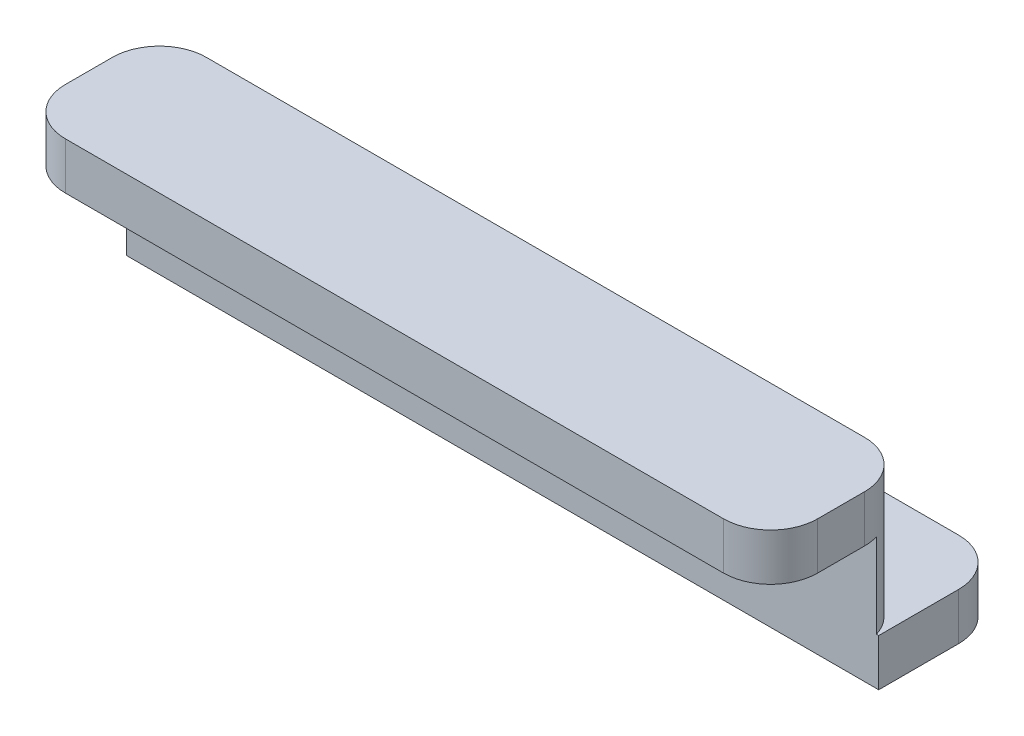
ISO-10303-21;
HEADER;
FILE_DESCRIPTION(('STEP AP214'),'2;1');
FILE_NAME('part.step','',(''),(''),'','','');
FILE_SCHEMA(('AUTOMOTIVE_DESIGN { 1 0 10303 214 1 1 1 1 }'));
ENDSEC;
DATA;
#1=APPLICATION_CONTEXT('core data for automotive mechanical design processes');
#2=APPLICATION_PROTOCOL_DEFINITION('international standard','automotive_design',2000,#1);
#3=PRODUCT_CONTEXT('',#1,'mechanical');
#4=PRODUCT('Part','Part','',(#3));
#5=PRODUCT_RELATED_PRODUCT_CATEGORY('part','',(#4));
#6=PRODUCT_DEFINITION_FORMATION('','',#4);
#7=PRODUCT_DEFINITION_CONTEXT('part definition',#1,'design');
#8=PRODUCT_DEFINITION('design','',#6,#7);
#9=PRODUCT_DEFINITION_SHAPE('','',#8);
#10=(LENGTH_UNIT() NAMED_UNIT(*) SI_UNIT(.MILLI.,.METRE.));
#11=(NAMED_UNIT(*) PLANE_ANGLE_UNIT() SI_UNIT($,.RADIAN.));
#12=(NAMED_UNIT(*) SI_UNIT($,.STERADIAN.) SOLID_ANGLE_UNIT());
#13=UNCERTAINTY_MEASURE_WITH_UNIT(LENGTH_MEASURE(1.E-05),#10,'distance_accuracy_value','');
#14=(GEOMETRIC_REPRESENTATION_CONTEXT(3) GLOBAL_UNCERTAINTY_ASSIGNED_CONTEXT((#13)) GLOBAL_UNIT_ASSIGNED_CONTEXT((#10,
#11,#12)) REPRESENTATION_CONTEXT('',''));
#15=CARTESIAN_POINT('',(0.,0.,0.));
#16=DIRECTION('',(0.,0.,1.));
#17=DIRECTION('',(1.,0.,0.));
#18=AXIS2_PLACEMENT_3D('',#15,#16,#17);
#19=CARTESIAN_POINT('',(30.,2.,-4.));
#20=DIRECTION('',(0.,-1.,0.));
#21=DIRECTION('',(0.,0.,-1.));
#22=AXIS2_PLACEMENT_3D('',#19,#20,#21);
#23=CYLINDRICAL_SURFACE('',#22,2.);
#24=DIRECTION('',(0.,-1.,0.));
#25=VECTOR('',#24,1.);
#26=CARTESIAN_POINT('',(31.9078784028339,2.,-4.6));
#27=LINE('',#26,#25);
#28=CARTESIAN_POINT('',(31.9078784028339,-3.59999999999977,-4.6));
#29=VERTEX_POINT('',#28);
#30=CARTESIAN_POINT('',(31.9078784028339,0.,-4.6));
#31=VERTEX_POINT('',#30);
#32=EDGE_CURVE('E221',#29,#31,#27,.F.);
#33=ORIENTED_EDGE('',*,*,#32,.F.);
#34=CARTESIAN_POINT('',(30.,-3.59999999999978,-4.00000000000001));
#35=DIRECTION('',(0.,1.,0.));
#36=DIRECTION('',(1.,0.,0.));
#37=AXIS2_PLACEMENT_3D('',#34,#35,#36);
#38=CIRCLE('',#37,2.00000000000001);
#39=CARTESIAN_POINT('',(30.,-3.59999999999987,-6.));
#40=VERTEX_POINT('',#39);
#41=EDGE_CURVE('E244',#29,#40,#38,.T.);
#42=ORIENTED_EDGE('',*,*,#41,.T.);
#43=DIRECTION('',(0.,-1.,0.));
#44=VECTOR('',#43,1.);
#45=CARTESIAN_POINT('',(30.,2.,-6.));
#46=LINE('',#45,#44);
#47=CARTESIAN_POINT('',(30.,2.,-6.));
#48=VERTEX_POINT('',#47);
#49=EDGE_CURVE('E215',#48,#40,#46,.T.);
#50=ORIENTED_EDGE('',*,*,#49,.F.);
#51=CARTESIAN_POINT('',(30.,2.,-4.));
#52=DIRECTION('',(0.,1.,0.));
#53=DIRECTION('',(0.,0.,-1.));
#54=AXIS2_PLACEMENT_3D('',#51,#52,#53);
#55=CIRCLE('',#54,2.);
#56=CARTESIAN_POINT('',(32.,2.,-4.));
#57=VERTEX_POINT('',#56);
#58=EDGE_CURVE('E172',#57,#48,#55,.T.);
#59=ORIENTED_EDGE('',*,*,#58,.F.);
#60=DIRECTION('',(0.,-1.,0.));
#61=VECTOR('',#60,1.);
#62=CARTESIAN_POINT('',(32.,2.,-4.));
#63=LINE('',#62,#61);
#64=CARTESIAN_POINT('',(32.,0.,-4.));
#65=VERTEX_POINT('',#64);
#66=EDGE_CURVE('E190',#57,#65,#63,.T.);
#67=ORIENTED_EDGE('',*,*,#66,.T.);
#68=CARTESIAN_POINT('',(30.,0.,-4.));
#69=DIRECTION('',(0.,-1.,0.));
#70=DIRECTION('',(0.,0.,-1.));
#71=AXIS2_PLACEMENT_3D('',#68,#69,#70);
#72=CIRCLE('',#71,2.);
#73=EDGE_CURVE('E232',#31,#65,#72,.T.);
#74=ORIENTED_EDGE('',*,*,#73,.F.);
#75=EDGE_LOOP('',(#33,#42,#50,#59,#67,#74));
#76=FACE_BOUND('',#75,.T.);
#77=ADVANCED_FACE('F33',(#76),#23,.T.);
#78=CARTESIAN_POINT('',(2.,2.,-4.));
#79=DIRECTION('',(0.,-1.,0.));
#80=DIRECTION('',(0.,0.,-1.));
#81=AXIS2_PLACEMENT_3D('',#78,#79,#80);
#82=CYLINDRICAL_SURFACE('',#81,2.);
#83=DIRECTION('',(0.,-1.,0.));
#84=VECTOR('',#83,1.);
#85=CARTESIAN_POINT('',(0.0921215971661099,2.,-4.6));
#86=LINE('',#85,#84);
#87=CARTESIAN_POINT('',(0.0921215971661099,0.,-4.6));
#88=VERTEX_POINT('',#87);
#89=CARTESIAN_POINT('',(0.0921215971661467,-3.59999999999999,-4.6));
#90=VERTEX_POINT('',#89);
#91=EDGE_CURVE('E47',#88,#90,#86,.T.);
#92=ORIENTED_EDGE('',*,*,#91,.F.);
#93=CARTESIAN_POINT('',(2.,0.,-4.));
#94=DIRECTION('',(0.,-1.,0.));
#95=DIRECTION('',(0.,0.,-1.));
#96=AXIS2_PLACEMENT_3D('',#93,#94,#95);
#97=CIRCLE('',#96,2.);
#98=CARTESIAN_POINT('',(0.,0.,-4.));
#99=VERTEX_POINT('',#98);
#100=EDGE_CURVE('E225',#99,#88,#97,.T.);
#101=ORIENTED_EDGE('',*,*,#100,.F.);
#102=DIRECTION('',(0.,-1.,0.));
#103=VECTOR('',#102,1.);
#104=CARTESIAN_POINT('',(0.,2.,-4.));
#105=LINE('',#104,#103);
#106=CARTESIAN_POINT('',(0.,2.,-4.));
#107=VERTEX_POINT('',#106);
#108=EDGE_CURVE('E209',#107,#99,#105,.T.);
#109=ORIENTED_EDGE('',*,*,#108,.F.);
#110=CARTESIAN_POINT('',(2.,2.,-4.));
#111=DIRECTION('',(0.,1.,0.));
#112=DIRECTION('',(0.,0.,-1.));
#113=AXIS2_PLACEMENT_3D('',#110,#111,#112);
#114=CIRCLE('',#113,2.);
#115=CARTESIAN_POINT('',(2.,2.,-6.));
#116=VERTEX_POINT('',#115);
#117=EDGE_CURVE('E178',#116,#107,#114,.T.);
#118=ORIENTED_EDGE('',*,*,#117,.F.);
#119=DIRECTION('',(0.,-1.,0.));
#120=VECTOR('',#119,1.);
#121=CARTESIAN_POINT('',(2.,2.,-6.));
#122=LINE('',#121,#120);
#123=CARTESIAN_POINT('',(2.,-3.59999999999996,-6.));
#124=VERTEX_POINT('',#123);
#125=EDGE_CURVE('E212',#116,#124,#122,.T.);
#126=ORIENTED_EDGE('',*,*,#125,.T.);
#127=CARTESIAN_POINT('',(2.00000000000004,-3.59999999999998,-4.00000000000001));
#128=DIRECTION('',(0.,1.,0.));
#129=DIRECTION('',(1.,0.,0.));
#130=AXIS2_PLACEMENT_3D('',#127,#128,#129);
#131=CIRCLE('',#130,2.);
#132=EDGE_CURVE('E237',#124,#90,#131,.T.);
#133=ORIENTED_EDGE('',*,*,#132,.T.);
#134=EDGE_LOOP('',(#92,#101,#109,#118,#126,#133));
#135=FACE_BOUND('',#134,.T.);
#136=ADVANCED_FACE('F235',(#135),#82,.T.);
#137=CARTESIAN_POINT('',(0.,2.,-2.));
#138=DIRECTION('',(1.,0.,0.));
#139=DIRECTION('',(0.,0.,-1.));
#140=AXIS2_PLACEMENT_3D('',#137,#138,#139);
#141=PLANE('',#140);
#142=DIRECTION('',(0.,1.,0.));
#143=VECTOR('',#142,1.);
#144=CARTESIAN_POINT('',(0.,-5.6,-4.6));
#145=LINE('',#144,#143);
#146=CARTESIAN_POINT('',(0.,-5.6,-4.6));
#147=VERTEX_POINT('',#146);
#148=CARTESIAN_POINT('',(0.,-3.59999999999988,-4.6));
#149=VERTEX_POINT('',#148);
#150=EDGE_CURVE('E153',#147,#149,#145,.T.);
#151=ORIENTED_EDGE('',*,*,#150,.T.);
#152=DIRECTION('',(0.,0.,-1.));
#153=VECTOR('',#152,1.);
#154=CARTESIAN_POINT('',(0.,-3.59999999999999,-4.00000000000001));
#155=LINE('',#154,#153);
#156=CARTESIAN_POINT('',(0.,-3.59999999999998,-8.));
#157=VERTEX_POINT('',#156);
#158=EDGE_CURVE('E250',#149,#157,#155,.T.);
#159=ORIENTED_EDGE('',*,*,#158,.T.);
#160=DIRECTION('',(0.,-1.,0.));
#161=VECTOR('',#160,1.);
#162=CARTESIAN_POINT('',(0.,-3.59999999999998,-8.));
#163=LINE('',#162,#161);
#164=CARTESIAN_POINT('',(0.,-5.59999999999998,-8.00000000000001));
#165=VERTEX_POINT('',#164);
#166=EDGE_CURVE('E160',#157,#165,#163,.T.);
#167=ORIENTED_EDGE('',*,*,#166,.T.);
#168=DIRECTION('',(0.,0.,1.));
#169=VECTOR('',#168,1.);
#170=CARTESIAN_POINT('',(0.,-5.6,-4.));
#171=LINE('',#170,#169);
#172=EDGE_CURVE('E147',#165,#147,#171,.T.);
#173=ORIENTED_EDGE('',*,*,#172,.T.);
#174=EDGE_LOOP('',(#151,#159,#167,#173));
#175=FACE_BOUND('',#174,.T.);
#176=ADVANCED_FACE('F158',(#175),#141,.F.);
#177=DIRECTION('',(0.,0.,-1.));
#178=VECTOR('',#177,1.);
#179=CARTESIAN_POINT('',(0.,0.,0.));
#180=LINE('',#179,#178);
#181=CARTESIAN_POINT('',(0.,0.,-2.));
#182=VERTEX_POINT('',#181);
#183=EDGE_CURVE('E229',#182,#99,#180,.T.);
#184=ORIENTED_EDGE('',*,*,#183,.F.);
#185=DIRECTION('',(0.,-1.,0.));
#186=VECTOR('',#185,1.);
#187=CARTESIAN_POINT('',(0.,2.,-2.));
#188=LINE('',#187,#186);
#189=CARTESIAN_POINT('',(0.,2.,-2.));
#190=VERTEX_POINT('',#189);
#191=EDGE_CURVE('E206',#190,#182,#188,.T.);
#192=ORIENTED_EDGE('',*,*,#191,.F.);
#193=DIRECTION('',(0.,0.,1.));
#194=VECTOR('',#193,1.);
#195=CARTESIAN_POINT('',(0.,2.,-2.));
#196=LINE('',#195,#194);
#197=EDGE_CURVE('E180',#107,#190,#196,.T.);
#198=ORIENTED_EDGE('',*,*,#197,.F.);
#199=ORIENTED_EDGE('',*,*,#108,.T.);
#200=EDGE_LOOP('',(#184,#192,#198,#199));
#201=FACE_BOUND('',#200,.T.);
#202=ADVANCED_FACE('F306',(#201),#141,.F.);
#203=CARTESIAN_POINT('',(2.,2.,-2.));
#204=DIRECTION('',(0.,-1.,0.));
#205=DIRECTION('',(0.,0.,-1.));
#206=AXIS2_PLACEMENT_3D('',#203,#204,#205);
#207=CYLINDRICAL_SURFACE('',#206,2.);
#208=ORIENTED_EDGE('',*,*,#191,.T.);
#209=CARTESIAN_POINT('',(2.,0.,-2.));
#210=DIRECTION('',(0.,1.,0.));
#211=DIRECTION('',(0.,0.,-1.));
#212=AXIS2_PLACEMENT_3D('',#209,#210,#211);
#213=CIRCLE('',#212,2.);
#214=CARTESIAN_POINT('',(2.,0.,0.));
#215=VERTEX_POINT('',#214);
#216=EDGE_CURVE('E171',#182,#215,#213,.T.);
#217=ORIENTED_EDGE('',*,*,#216,.T.);
#218=DIRECTION('',(0.,-1.,0.));
#219=VECTOR('',#218,1.);
#220=CARTESIAN_POINT('',(2.,2.,0.));
#221=LINE('',#220,#219);
#222=CARTESIAN_POINT('',(2.,2.,0.));
#223=VERTEX_POINT('',#222);
#224=EDGE_CURVE('E203',#223,#215,#221,.T.);
#225=ORIENTED_EDGE('',*,*,#224,.F.);
#226=CARTESIAN_POINT('',(2.,2.,-2.));
#227=DIRECTION('',(0.,1.,0.));
#228=DIRECTION('',(0.,0.,-1.));
#229=AXIS2_PLACEMENT_3D('',#226,#227,#228);
#230=CIRCLE('',#229,2.);
#231=EDGE_CURVE('E182',#190,#223,#230,.T.);
#232=ORIENTED_EDGE('',*,*,#231,.F.);
#233=EDGE_LOOP('',(#208,#217,#225,#232));
#234=FACE_BOUND('',#233,.T.);
#235=ADVANCED_FACE('F309',(#234),#207,.T.);
#236=CARTESIAN_POINT('',(30.,2.,-2.));
#237=DIRECTION('',(0.,-1.,0.));
#238=DIRECTION('',(0.,0.,-1.));
#239=AXIS2_PLACEMENT_3D('',#236,#237,#238);
#240=CYLINDRICAL_SURFACE('',#239,2.);
#241=CARTESIAN_POINT('',(30.,0.,-2.));
#242=DIRECTION('',(0.,1.,0.));
#243=DIRECTION('',(0.,0.,1.));
#244=AXIS2_PLACEMENT_3D('',#241,#242,#243);
#245=CIRCLE('',#244,2.);
#246=CARTESIAN_POINT('',(30.,0.,0.));
#247=VERTEX_POINT('',#246);
#248=CARTESIAN_POINT('',(32.,0.,-2.));
#249=VERTEX_POINT('',#248);
#250=EDGE_CURVE('E176',#247,#249,#245,.T.);
#251=ORIENTED_EDGE('',*,*,#250,.T.);
#252=DIRECTION('',(0.,-1.,0.));
#253=VECTOR('',#252,1.);
#254=CARTESIAN_POINT('',(32.,2.,-2.));
#255=LINE('',#254,#253);
#256=CARTESIAN_POINT('',(32.,2.,-2.));
#257=VERTEX_POINT('',#256);
#258=EDGE_CURVE('E197',#257,#249,#255,.T.);
#259=ORIENTED_EDGE('',*,*,#258,.F.);
#260=CARTESIAN_POINT('',(30.,2.,-2.));
#261=DIRECTION('',(0.,1.,0.));
#262=DIRECTION('',(0.,0.,1.));
#263=AXIS2_PLACEMENT_3D('',#260,#261,#262);
#264=CIRCLE('',#263,2.);
#265=CARTESIAN_POINT('',(30.,2.,0.));
#266=VERTEX_POINT('',#265);
#267=EDGE_CURVE('E186',#266,#257,#264,.T.);
#268=ORIENTED_EDGE('',*,*,#267,.F.);
#269=DIRECTION('',(0.,-1.,0.));
#270=VECTOR('',#269,1.);
#271=CARTESIAN_POINT('',(30.,2.,0.));
#272=LINE('',#271,#270);
#273=EDGE_CURVE('E200',#266,#247,#272,.T.);
#274=ORIENTED_EDGE('',*,*,#273,.T.);
#275=EDGE_LOOP('',(#251,#259,#268,#274));
#276=FACE_BOUND('',#275,.T.);
#277=ADVANCED_FACE('F297',(#276),#240,.T.);
#278=CARTESIAN_POINT('',(32.,2.,-2.));
#279=DIRECTION('',(-1.,0.,0.));
#280=DIRECTION('',(0.,0.,1.));
#281=AXIS2_PLACEMENT_3D('',#278,#279,#280);
#282=PLANE('',#281);
#283=DIRECTION('',(0.,1.,0.));
#284=VECTOR('',#283,1.);
#285=CARTESIAN_POINT('',(32.,-5.6,-4.6));
#286=LINE('',#285,#284);
#287=CARTESIAN_POINT('',(32.,-5.6,-4.6));
#288=VERTEX_POINT('',#287);
#289=CARTESIAN_POINT('',(32.,-3.59999999999977,-4.6));
#290=VERTEX_POINT('',#289);
#291=EDGE_CURVE('E53',#288,#290,#286,.T.);
#292=ORIENTED_EDGE('',*,*,#291,.F.);
#293=DIRECTION('',(0.,0.,-1.));
#294=VECTOR('',#293,1.);
#295=CARTESIAN_POINT('',(32.,-5.6,-4.));
#296=LINE('',#295,#294);
#297=CARTESIAN_POINT('',(32.,-5.59999999999976,-8.00000000000001));
#298=VERTEX_POINT('',#297);
#299=EDGE_CURVE('E150',#288,#298,#296,.T.);
#300=ORIENTED_EDGE('',*,*,#299,.T.);
#301=DIRECTION('',(0.,-1.,0.));
#302=VECTOR('',#301,1.);
#303=CARTESIAN_POINT('',(32.,-3.59999999999976,-8.));
#304=LINE('',#303,#302);
#305=CARTESIAN_POINT('',(32.,-3.59999999999976,-8.));
#306=VERTEX_POINT('',#305);
#307=EDGE_CURVE('E162',#306,#298,#304,.T.);
#308=ORIENTED_EDGE('',*,*,#307,.F.);
#309=DIRECTION('',(0.,0.,1.));
#310=VECTOR('',#309,1.);
#311=CARTESIAN_POINT('',(32.,-3.59999999999976,-8.));
#312=LINE('',#311,#310);
#313=EDGE_CURVE('E261',#306,#290,#312,.T.);
#314=ORIENTED_EDGE('',*,*,#313,.T.);
#315=EDGE_LOOP('',(#292,#300,#308,#314));
#316=FACE_BOUND('',#315,.T.);
#317=ADVANCED_FACE('F283',(#316),#282,.F.);
#318=DIRECTION('',(0.,0.,1.));
#319=VECTOR('',#318,1.);
#320=CARTESIAN_POINT('',(32.,0.,0.));
#321=LINE('',#320,#319);
#322=EDGE_CURVE('E284',#65,#249,#321,.T.);
#323=ORIENTED_EDGE('',*,*,#322,.F.);
#324=ORIENTED_EDGE('',*,*,#66,.F.);
#325=DIRECTION('',(0.,0.,-1.));
#326=VECTOR('',#325,1.);
#327=CARTESIAN_POINT('',(32.,2.,-2.));
#328=LINE('',#327,#326);
#329=EDGE_CURVE('E188',#257,#57,#328,.T.);
#330=ORIENTED_EDGE('',*,*,#329,.F.);
#331=ORIENTED_EDGE('',*,*,#258,.T.);
#332=EDGE_LOOP('',(#323,#324,#330,#331));
#333=FACE_BOUND('',#332,.T.);
#334=ADVANCED_FACE('F294',(#333),#282,.F.);
#335=CARTESIAN_POINT('',(2.,-5.6,-4.));
#336=DIRECTION('',(0.,1.,0.));
#337=DIRECTION('',(0.,0.,1.));
#338=AXIS2_PLACEMENT_3D('',#335,#336,#337);
#339=PLANE('',#338);
#340=DIRECTION('',(1.,0.,0.));
#341=VECTOR('',#340,1.);
#342=CARTESIAN_POINT('',(3.4,-5.6,-4.6));
#343=LINE('',#342,#341);
#344=EDGE_CURVE('E142',#147,#288,#343,.T.);
#345=ORIENTED_EDGE('',*,*,#344,.F.);
#346=ORIENTED_EDGE('',*,*,#172,.F.);
#347=CARTESIAN_POINT('',(2.,-5.59999999999997,-8.00000000000001));
#348=DIRECTION('',(0.,-1.,0.));
#349=DIRECTION('',(1.,0.,0.));
#350=AXIS2_PLACEMENT_3D('',#347,#348,#349);
#351=CIRCLE('',#350,2.);
#352=CARTESIAN_POINT('',(2.,-5.59999999999996,-10.));
#353=VERTEX_POINT('',#352);
#354=EDGE_CURVE('E243',#165,#353,#351,.T.);
#355=ORIENTED_EDGE('',*,*,#354,.T.);
#356=DIRECTION('',(1.,0.,0.));
#357=VECTOR('',#356,1.);
#358=CARTESIAN_POINT('',(2.,-5.59999999999996,-10.));
#359=LINE('',#358,#357);
#360=CARTESIAN_POINT('',(30.,-5.59999999999977,-10.));
#361=VERTEX_POINT('',#360);
#362=EDGE_CURVE('E265',#353,#361,#359,.T.);
#363=ORIENTED_EDGE('',*,*,#362,.T.);
#364=CARTESIAN_POINT('',(30.,-5.59999999999977,-8.00000000000001));
#365=DIRECTION('',(0.,-1.,0.));
#366=DIRECTION('',(1.,0.,0.));
#367=AXIS2_PLACEMENT_3D('',#364,#365,#366);
#368=CIRCLE('',#367,2.);
#369=EDGE_CURVE('E247',#361,#298,#368,.T.);
#370=ORIENTED_EDGE('',*,*,#369,.T.);
#371=ORIENTED_EDGE('',*,*,#299,.F.);
#372=EDGE_LOOP('',(#345,#346,#355,#363,#370,#371));
#373=FACE_BOUND('',#372,.T.);
#374=ADVANCED_FACE('F144',(#373),#339,.F.);
#375=CARTESIAN_POINT('',(30.,-3.59999999999978,-4.00000000000001));
#376=DIRECTION('',(0.,-1.,0.));
#377=DIRECTION('',(1.,0.,0.));
#378=AXIS2_PLACEMENT_3D('',#375,#376,#377);
#379=PLANE('',#378);
#380=DIRECTION('',(-1.,0.,0.));
#381=VECTOR('',#380,1.);
#382=CARTESIAN_POINT('',(30.,-3.59999999999978,-4.6));
#383=LINE('',#382,#381);
#384=EDGE_CURVE('E11',#290,#29,#383,.T.);
#385=ORIENTED_EDGE('',*,*,#384,.F.);
#386=ORIENTED_EDGE('',*,*,#313,.F.);
#387=CARTESIAN_POINT('',(30.,-3.59999999999977,-8.));
#388=DIRECTION('',(0.,-1.,0.));
#389=DIRECTION('',(1.,0.,0.));
#390=AXIS2_PLACEMENT_3D('',#387,#388,#389);
#391=CIRCLE('',#390,2.);
#392=CARTESIAN_POINT('',(30.,-3.59999999999977,-10.));
#393=VERTEX_POINT('',#392);
#394=EDGE_CURVE('E258',#393,#306,#391,.T.);
#395=ORIENTED_EDGE('',*,*,#394,.F.);
#396=DIRECTION('',(1.,0.,0.));
#397=VECTOR('',#396,1.);
#398=CARTESIAN_POINT('',(1.99999999999999,-3.59999999999996,-10.));
#399=LINE('',#398,#397);
#400=CARTESIAN_POINT('',(1.99999999999999,-3.59999999999996,-10.));
#401=VERTEX_POINT('',#400);
#402=EDGE_CURVE('E255',#401,#393,#399,.T.);
#403=ORIENTED_EDGE('',*,*,#402,.F.);
#404=CARTESIAN_POINT('',(1.99999999999999,-3.59999999999997,-8.));
#405=DIRECTION('',(0.,-1.,0.));
#406=DIRECTION('',(1.,0.,0.));
#407=AXIS2_PLACEMENT_3D('',#404,#405,#406);
#408=CIRCLE('',#407,2.);
#409=EDGE_CURVE('E252',#157,#401,#408,.T.);
#410=ORIENTED_EDGE('',*,*,#409,.F.);
#411=ORIENTED_EDGE('',*,*,#158,.F.);
#412=EDGE_CURVE('E36',#90,#149,#383,.T.);
#413=ORIENTED_EDGE('',*,*,#412,.F.);
#414=ORIENTED_EDGE('',*,*,#132,.F.);
#415=DIRECTION('',(-1.,0.,0.));
#416=VECTOR('',#415,1.);
#417=CARTESIAN_POINT('',(30.,-3.59999999999978,-6.00000000000001));
#418=LINE('',#417,#416);
#419=EDGE_CURVE('E246',#40,#124,#418,.T.);
#420=ORIENTED_EDGE('',*,*,#419,.F.);
#421=ORIENTED_EDGE('',*,*,#41,.F.);
#422=EDGE_LOOP('',(#385,#386,#395,#403,#410,#411,#413,#414,#420,#421));
#423=FACE_BOUND('',#422,.T.);
#424=ADVANCED_FACE('F317',(#423),#379,.F.);
#425=CARTESIAN_POINT('',(2.,2.,-6.));
#426=DIRECTION('',(0.,0.,1.));
#427=DIRECTION('',(1.,0.,0.));
#428=AXIS2_PLACEMENT_3D('',#425,#426,#427);
#429=PLANE('',#428);
#430=ORIENTED_EDGE('',*,*,#419,.T.);
#431=ORIENTED_EDGE('',*,*,#125,.F.);
#432=DIRECTION('',(-1.,0.,0.));
#433=VECTOR('',#432,1.);
#434=CARTESIAN_POINT('',(2.,2.,-6.));
#435=LINE('',#434,#433);
#436=EDGE_CURVE('E175',#48,#116,#435,.T.);
#437=ORIENTED_EDGE('',*,*,#436,.F.);
#438=ORIENTED_EDGE('',*,*,#49,.T.);
#439=EDGE_LOOP('',(#430,#431,#437,#438));
#440=FACE_BOUND('',#439,.T.);
#441=ADVANCED_FACE('F322',(#440),#429,.F.);
#442=CARTESIAN_POINT('',(2.,2.,0.));
#443=DIRECTION('',(0.,0.,-1.));
#444=DIRECTION('',(-1.,0.,0.));
#445=AXIS2_PLACEMENT_3D('',#442,#443,#444);
#446=PLANE('',#445);
#447=DIRECTION('',(1.,0.,0.));
#448=VECTOR('',#447,1.);
#449=CARTESIAN_POINT('',(2.,0.,0.));
#450=LINE('',#449,#448);
#451=EDGE_CURVE('E192',#215,#247,#450,.T.);
#452=ORIENTED_EDGE('',*,*,#451,.T.);
#453=ORIENTED_EDGE('',*,*,#273,.F.);
#454=DIRECTION('',(1.,0.,0.));
#455=VECTOR('',#454,1.);
#456=CARTESIAN_POINT('',(2.,2.,0.));
#457=LINE('',#456,#455);
#458=EDGE_CURVE('E184',#223,#266,#457,.T.);
#459=ORIENTED_EDGE('',*,*,#458,.F.);
#460=ORIENTED_EDGE('',*,*,#224,.T.);
#461=EDGE_LOOP('',(#452,#453,#459,#460));
#462=FACE_BOUND('',#461,.T.);
#463=ADVANCED_FACE('F301',(#462),#446,.F.);
#464=CARTESIAN_POINT('',(30.,2.,-4.));
#465=DIRECTION('',(0.,-1.,0.));
#466=DIRECTION('',(0.,0.,-1.));
#467=AXIS2_PLACEMENT_3D('',#464,#465,#466);
#468=PLANE('',#467);
#469=ORIENTED_EDGE('',*,*,#267,.T.);
#470=ORIENTED_EDGE('',*,*,#329,.T.);
#471=ORIENTED_EDGE('',*,*,#58,.T.);
#472=ORIENTED_EDGE('',*,*,#436,.T.);
#473=ORIENTED_EDGE('',*,*,#117,.T.);
#474=ORIENTED_EDGE('',*,*,#197,.T.);
#475=ORIENTED_EDGE('',*,*,#231,.T.);
#476=ORIENTED_EDGE('',*,*,#458,.T.);
#477=EDGE_LOOP('',(#469,#470,#471,#472,#473,#474,#475,#476));
#478=FACE_BOUND('',#477,.T.);
#479=ADVANCED_FACE('F311',(#478),#468,.F.);
#480=CARTESIAN_POINT('',(30.,0.,-4.));
#481=DIRECTION('',(0.,-1.,0.));
#482=DIRECTION('',(0.,0.,-1.));
#483=AXIS2_PLACEMENT_3D('',#480,#481,#482);
#484=PLANE('',#483);
#485=ORIENTED_EDGE('',*,*,#322,.T.);
#486=ORIENTED_EDGE('',*,*,#250,.F.);
#487=ORIENTED_EDGE('',*,*,#451,.F.);
#488=ORIENTED_EDGE('',*,*,#216,.F.);
#489=ORIENTED_EDGE('',*,*,#183,.T.);
#490=ORIENTED_EDGE('',*,*,#100,.T.);
#491=DIRECTION('',(-1.,0.,0.));
#492=VECTOR('',#491,1.);
#493=CARTESIAN_POINT('',(30.,0.,-4.6));
#494=LINE('',#493,#492);
#495=EDGE_CURVE('E217',#31,#88,#494,.T.);
#496=ORIENTED_EDGE('',*,*,#495,.F.);
#497=ORIENTED_EDGE('',*,*,#73,.T.);
#498=EDGE_LOOP('',(#485,#486,#487,#488,#489,#490,#496,#497));
#499=FACE_BOUND('',#498,.T.);
#500=ADVANCED_FACE('F227',(#499),#484,.T.);
#501=CARTESIAN_POINT('',(3.4,-5.6,-4.6));
#502=DIRECTION('',(0.,0.,1.));
#503=DIRECTION('',(1.,0.,0.));
#504=AXIS2_PLACEMENT_3D('',#501,#502,#503);
#505=PLANE('',#504);
#506=ORIENTED_EDGE('',*,*,#344,.T.);
#507=ORIENTED_EDGE('',*,*,#291,.T.);
#508=ORIENTED_EDGE('',*,*,#384,.T.);
#509=ORIENTED_EDGE('',*,*,#32,.T.);
#510=ORIENTED_EDGE('',*,*,#495,.T.);
#511=ORIENTED_EDGE('',*,*,#91,.T.);
#512=ORIENTED_EDGE('',*,*,#412,.T.);
#513=ORIENTED_EDGE('',*,*,#150,.F.);
#514=EDGE_LOOP('',(#506,#507,#508,#509,#510,#511,#512,#513));
#515=FACE_BOUND('',#514,.T.);
#516=ADVANCED_FACE('F154',(#515),#505,.T.);
#517=CARTESIAN_POINT('',(30.,-3.59999999999977,-8.));
#518=DIRECTION('',(0.,-1.,0.));
#519=DIRECTION('',(1.,0.,0.));
#520=AXIS2_PLACEMENT_3D('',#517,#518,#519);
#521=CYLINDRICAL_SURFACE('',#520,2.);
#522=ORIENTED_EDGE('',*,*,#369,.F.);
#523=DIRECTION('',(0.,-1.,0.));
#524=VECTOR('',#523,1.);
#525=CARTESIAN_POINT('',(30.,-3.59999999999977,-10.));
#526=LINE('',#525,#524);
#527=EDGE_CURVE('E165',#393,#361,#526,.T.);
#528=ORIENTED_EDGE('',*,*,#527,.F.);
#529=ORIENTED_EDGE('',*,*,#394,.T.);
#530=ORIENTED_EDGE('',*,*,#307,.T.);
#531=EDGE_LOOP('',(#522,#528,#529,#530));
#532=FACE_BOUND('',#531,.T.);
#533=ADVANCED_FACE('F279',(#532),#521,.T.);
#534=CARTESIAN_POINT('',(1.99999999999999,-3.59999999999996,-10.));
#535=DIRECTION('',(0.,0.,-1.));
#536=DIRECTION('',(0.,1.,0.));
#537=AXIS2_PLACEMENT_3D('',#534,#535,#536);
#538=PLANE('',#537);
#539=ORIENTED_EDGE('',*,*,#362,.F.);
#540=DIRECTION('',(0.,-1.,0.));
#541=VECTOR('',#540,1.);
#542=CARTESIAN_POINT('',(1.99999999999999,-3.59999999999996,-10.));
#543=LINE('',#542,#541);
#544=EDGE_CURVE('E269',#401,#353,#543,.T.);
#545=ORIENTED_EDGE('',*,*,#544,.F.);
#546=ORIENTED_EDGE('',*,*,#402,.T.);
#547=ORIENTED_EDGE('',*,*,#527,.T.);
#548=EDGE_LOOP('',(#539,#545,#546,#547));
#549=FACE_BOUND('',#548,.T.);
#550=ADVANCED_FACE('F276',(#549),#538,.T.);
#551=CARTESIAN_POINT('',(1.99999999999999,-3.59999999999997,-8.));
#552=DIRECTION('',(0.,-1.,0.));
#553=DIRECTION('',(1.,0.,0.));
#554=AXIS2_PLACEMENT_3D('',#551,#552,#553);
#555=CYLINDRICAL_SURFACE('',#554,2.);
#556=ORIENTED_EDGE('',*,*,#354,.F.);
#557=ORIENTED_EDGE('',*,*,#166,.F.);
#558=ORIENTED_EDGE('',*,*,#409,.T.);
#559=ORIENTED_EDGE('',*,*,#544,.T.);
#560=EDGE_LOOP('',(#556,#557,#558,#559));
#561=FACE_BOUND('',#560,.T.);
#562=ADVANCED_FACE('F272',(#561),#555,.T.);
#563=CLOSED_SHELL('',(#77,#136,#176,#202,#235,#277,#317,#334,#374,#424,#441,#463,#479,#500,#516,
#533,#550,#562));
#564=MANIFOLD_SOLID_BREP('B2',#563);
#565=ADVANCED_BREP_SHAPE_REPRESENTATION('',(#18,#564),#14);
#566=SHAPE_DEFINITION_REPRESENTATION(#9,#565);
ENDSEC;
END-ISO-10303-21;
